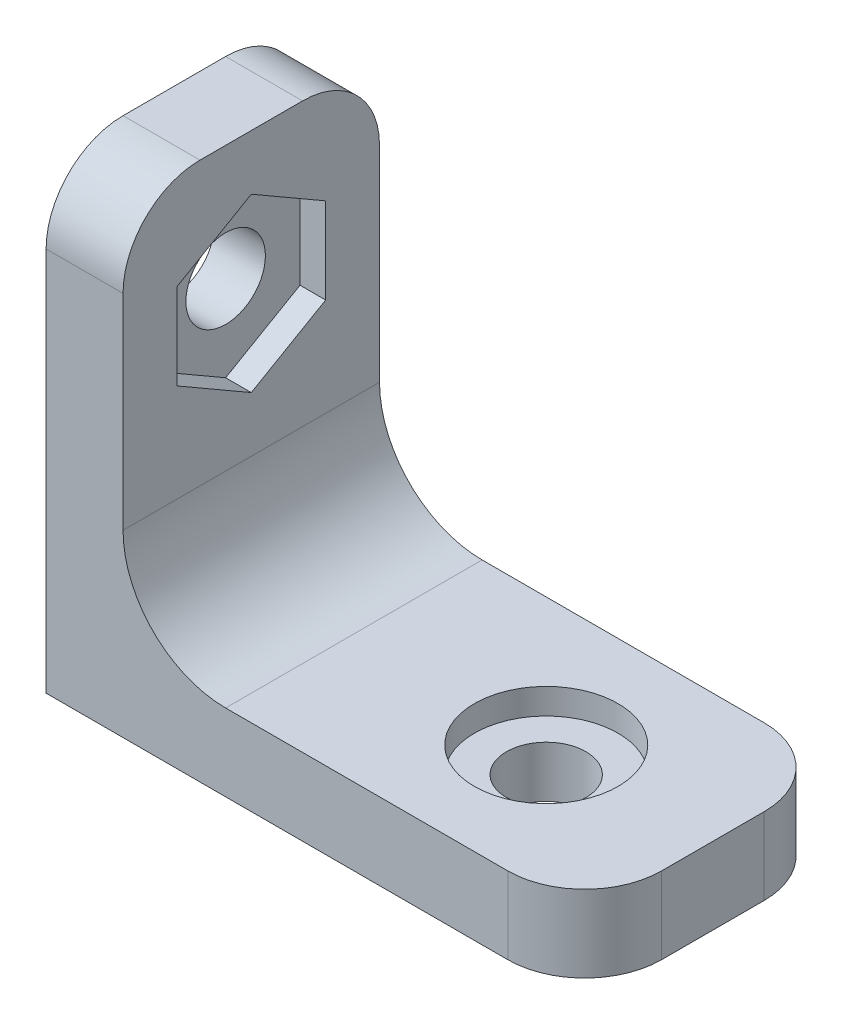
ISO-10303-21;
HEADER;
FILE_DESCRIPTION(('STEP AP214'),'2;1');
FILE_NAME('part.step','',(''),(''),'','','');
FILE_SCHEMA(('AUTOMOTIVE_DESIGN { 1 0 10303 214 1 1 1 1 }'));
ENDSEC;
DATA;
#1=APPLICATION_CONTEXT('core data for automotive mechanical design processes');
#2=APPLICATION_PROTOCOL_DEFINITION('international standard','automotive_design',2000,#1);
#3=PRODUCT_CONTEXT('',#1,'mechanical');
#4=PRODUCT('Part','Part','',(#3));
#5=PRODUCT_RELATED_PRODUCT_CATEGORY('part','',(#4));
#6=PRODUCT_DEFINITION_FORMATION('','',#4);
#7=PRODUCT_DEFINITION_CONTEXT('part definition',#1,'design');
#8=PRODUCT_DEFINITION('design','',#6,#7);
#9=PRODUCT_DEFINITION_SHAPE('','',#8);
#10=(LENGTH_UNIT() NAMED_UNIT(*) SI_UNIT(.MILLI.,.METRE.));
#11=(NAMED_UNIT(*) PLANE_ANGLE_UNIT() SI_UNIT($,.RADIAN.));
#12=(NAMED_UNIT(*) SI_UNIT($,.STERADIAN.) SOLID_ANGLE_UNIT());
#13=UNCERTAINTY_MEASURE_WITH_UNIT(LENGTH_MEASURE(1.E-05),#10,'distance_accuracy_value','');
#14=(GEOMETRIC_REPRESENTATION_CONTEXT(3) GLOBAL_UNCERTAINTY_ASSIGNED_CONTEXT((#13)) GLOBAL_UNIT_ASSIGNED_CONTEXT((#10,
#11,#12)) REPRESENTATION_CONTEXT('',''));
#15=CARTESIAN_POINT('',(0.,0.,0.));
#16=DIRECTION('',(0.,0.,1.));
#17=DIRECTION('',(1.,0.,0.));
#18=AXIS2_PLACEMENT_3D('',#15,#16,#17);
#19=CARTESIAN_POINT('',(7.3840620433566,12.5,-5.));
#20=DIRECTION('',(-1.,0.,0.));
#21=DIRECTION('',(0.,0.,1.));
#22=AXIS2_PLACEMENT_3D('',#19,#20,#21);
#23=CYLINDRICAL_SURFACE('',#22,1.55);
#24=CARTESIAN_POINT('',(0.,12.5,-5.));
#25=DIRECTION('',(-1.,0.,0.));
#26=DIRECTION('',(0.,0.,1.));
#27=AXIS2_PLACEMENT_3D('',#24,#25,#26);
#28=CIRCLE('',#27,1.55);
#29=CARTESIAN_POINT('',(0.,12.5,-3.45));
#30=VERTEX_POINT('',#29);
#31=EDGE_CURVE('E218',#30,#30,#28,.T.);
#32=ORIENTED_EDGE('',*,*,#31,.T.);
#33=EDGE_LOOP('',(#32));
#34=FACE_BOUND('',#33,.T.);
#35=CARTESIAN_POINT('',(2.,12.5,-5.));
#36=DIRECTION('',(1.,0.,0.));
#37=DIRECTION('',(0.,0.,-1.));
#38=AXIS2_PLACEMENT_3D('',#35,#36,#37);
#39=CIRCLE('',#38,1.55);
#40=CARTESIAN_POINT('',(2.,12.5,-6.55));
#41=VERTEX_POINT('',#40);
#42=EDGE_CURVE('E203',#41,#41,#39,.F.);
#43=ORIENTED_EDGE('',*,*,#42,.F.);
#44=EDGE_LOOP('',(#43));
#45=FACE_BOUND('',#44,.T.);
#46=ADVANCED_FACE('F33',(#34,#45),#23,.F.);
#47=CARTESIAN_POINT('',(14.5,3.,-5.));
#48=DIRECTION('',(0.,-1.,0.));
#49=DIRECTION('',(0.,0.,-1.));
#50=AXIS2_PLACEMENT_3D('',#47,#48,#49);
#51=CYLINDRICAL_SURFACE('',#50,1.55);
#52=CARTESIAN_POINT('',(14.5,0.,-5.));
#53=DIRECTION('',(0.,1.,0.));
#54=DIRECTION('',(0.,0.,1.));
#55=AXIS2_PLACEMENT_3D('',#52,#53,#54);
#56=CIRCLE('',#55,1.55);
#57=CARTESIAN_POINT('',(14.5,0.,-3.45));
#58=VERTEX_POINT('',#57);
#59=EDGE_CURVE('E232',#58,#58,#56,.T.);
#60=ORIENTED_EDGE('',*,*,#59,.F.);
#61=EDGE_LOOP('',(#60));
#62=FACE_BOUND('',#61,.T.);
#63=CARTESIAN_POINT('',(14.5,2.,-5.));
#64=DIRECTION('',(0.,1.,0.));
#65=DIRECTION('',(0.,0.,1.));
#66=AXIS2_PLACEMENT_3D('',#63,#64,#65);
#67=CIRCLE('',#66,1.55);
#68=CARTESIAN_POINT('',(14.5,2.,-3.45));
#69=VERTEX_POINT('',#68);
#70=EDGE_CURVE('E214',#69,#69,#67,.T.);
#71=ORIENTED_EDGE('',*,*,#70,.T.);
#72=EDGE_LOOP('',(#71));
#73=FACE_BOUND('',#72,.T.);
#74=ADVANCED_FACE('F336',(#62,#73),#51,.F.);
#75=CARTESIAN_POINT('',(0.,3.,0.));
#76=DIRECTION('',(0.,-1.,0.));
#77=DIRECTION('',(0.,0.,-1.));
#78=AXIS2_PLACEMENT_3D('',#75,#76,#77);
#79=PLANE('',#78);
#80=CARTESIAN_POINT('',(14.5,3.,-5.));
#81=DIRECTION('',(0.,1.,0.));
#82=DIRECTION('',(0.,0.,1.));
#83=AXIS2_PLACEMENT_3D('',#80,#81,#82);
#84=CIRCLE('',#83,2.8);
#85=CARTESIAN_POINT('',(14.5,3.,-2.2));
#86=VERTEX_POINT('',#85);
#87=EDGE_CURVE('E215',#86,#86,#84,.T.);
#88=ORIENTED_EDGE('',*,*,#87,.F.);
#89=EDGE_LOOP('',(#88));
#90=FACE_BOUND('',#89,.T.);
#91=DIRECTION('',(-1.,0.,0.));
#92=VECTOR('',#91,1.);
#93=CARTESIAN_POINT('',(0.,3.,-10.));
#94=LINE('',#93,#92);
#95=CARTESIAN_POINT('',(18.,3.,-10.));
#96=VERTEX_POINT('',#95);
#97=CARTESIAN_POINT('',(7.,3.,-10.));
#98=VERTEX_POINT('',#97);
#99=EDGE_CURVE('E242',#96,#98,#94,.T.);
#100=ORIENTED_EDGE('',*,*,#99,.T.);
#101=DIRECTION('',(0.,0.,-1.));
#102=VECTOR('',#101,1.);
#103=CARTESIAN_POINT('',(7.,3.,0.));
#104=LINE('',#103,#102);
#105=CARTESIAN_POINT('',(7.,3.,0.));
#106=VERTEX_POINT('',#105);
#107=EDGE_CURVE('E54',#98,#106,#104,.F.);
#108=ORIENTED_EDGE('',*,*,#107,.T.);
#109=DIRECTION('',(1.,0.,0.));
#110=VECTOR('',#109,1.);
#111=CARTESIAN_POINT('',(0.,3.,0.));
#112=LINE('',#111,#110);
#113=CARTESIAN_POINT('',(18.,3.,0.));
#114=VERTEX_POINT('',#113);
#115=EDGE_CURVE('E236',#106,#114,#112,.T.);
#116=ORIENTED_EDGE('',*,*,#115,.T.);
#117=CARTESIAN_POINT('',(18.,3.,-3.));
#118=DIRECTION('',(0.,-1.,0.));
#119=DIRECTION('',(0.,0.,-1.));
#120=AXIS2_PLACEMENT_3D('',#117,#118,#119);
#121=CIRCLE('',#120,3.);
#122=CARTESIAN_POINT('',(21.,3.,-3.));
#123=VERTEX_POINT('',#122);
#124=EDGE_CURVE('E297',#114,#123,#121,.F.);
#125=ORIENTED_EDGE('',*,*,#124,.T.);
#126=DIRECTION('',(0.,0.,-1.));
#127=VECTOR('',#126,1.);
#128=CARTESIAN_POINT('',(21.,3.,0.));
#129=LINE('',#128,#127);
#130=CARTESIAN_POINT('',(21.,3.,-7.));
#131=VERTEX_POINT('',#130);
#132=EDGE_CURVE('E238',#123,#131,#129,.T.);
#133=ORIENTED_EDGE('',*,*,#132,.T.);
#134=CARTESIAN_POINT('',(18.,3.,-7.));
#135=DIRECTION('',(0.,-1.,0.));
#136=DIRECTION('',(0.,0.,-1.));
#137=AXIS2_PLACEMENT_3D('',#134,#135,#136);
#138=CIRCLE('',#137,3.);
#139=EDGE_CURVE('E295',#131,#96,#138,.F.);
#140=ORIENTED_EDGE('',*,*,#139,.T.);
#141=EDGE_LOOP('',(#100,#108,#116,#125,#133,#140));
#142=FACE_BOUND('',#141,.T.);
#143=ADVANCED_FACE('F342',(#90,#142),#79,.F.);
#144=CARTESIAN_POINT('',(0.,0.,0.));
#145=DIRECTION('',(0.,-1.,0.));
#146=DIRECTION('',(0.,0.,-1.));
#147=AXIS2_PLACEMENT_3D('',#144,#145,#146);
#148=PLANE('',#147);
#149=DIRECTION('',(0.,0.,-1.));
#150=VECTOR('',#149,1.);
#151=CARTESIAN_POINT('',(21.,0.,0.));
#152=LINE('',#151,#150);
#153=CARTESIAN_POINT('',(21.,0.,-3.));
#154=VERTEX_POINT('',#153);
#155=CARTESIAN_POINT('',(21.,0.,-7.));
#156=VERTEX_POINT('',#155);
#157=EDGE_CURVE('E250',#154,#156,#152,.T.);
#158=ORIENTED_EDGE('',*,*,#157,.F.);
#159=CARTESIAN_POINT('',(18.,0.,-3.));
#160=DIRECTION('',(0.,-1.,0.));
#161=DIRECTION('',(0.,0.,-1.));
#162=AXIS2_PLACEMENT_3D('',#159,#160,#161);
#163=CIRCLE('',#162,3.);
#164=CARTESIAN_POINT('',(18.,0.,0.));
#165=VERTEX_POINT('',#164);
#166=EDGE_CURVE('E293',#154,#165,#163,.T.);
#167=ORIENTED_EDGE('',*,*,#166,.T.);
#168=DIRECTION('',(1.,0.,0.));
#169=VECTOR('',#168,1.);
#170=CARTESIAN_POINT('',(0.,0.,0.));
#171=LINE('',#170,#169);
#172=CARTESIAN_POINT('',(0.,0.,0.));
#173=VERTEX_POINT('',#172);
#174=EDGE_CURVE('E247',#173,#165,#171,.T.);
#175=ORIENTED_EDGE('',*,*,#174,.F.);
#176=DIRECTION('',(0.,0.,1.));
#177=VECTOR('',#176,1.);
#178=CARTESIAN_POINT('',(0.,0.,0.));
#179=LINE('',#178,#177);
#180=CARTESIAN_POINT('',(0.,0.,-10.));
#181=VERTEX_POINT('',#180);
#182=EDGE_CURVE('E235',#181,#173,#179,.T.);
#183=ORIENTED_EDGE('',*,*,#182,.F.);
#184=DIRECTION('',(-1.,0.,0.));
#185=VECTOR('',#184,1.);
#186=CARTESIAN_POINT('',(0.,0.,-10.));
#187=LINE('',#186,#185);
#188=CARTESIAN_POINT('',(18.,0.,-10.));
#189=VERTEX_POINT('',#188);
#190=EDGE_CURVE('E239',#189,#181,#187,.T.);
#191=ORIENTED_EDGE('',*,*,#190,.F.);
#192=CARTESIAN_POINT('',(18.,0.,-7.));
#193=DIRECTION('',(0.,-1.,0.));
#194=DIRECTION('',(0.,0.,-1.));
#195=AXIS2_PLACEMENT_3D('',#192,#193,#194);
#196=CIRCLE('',#195,3.);
#197=EDGE_CURVE('E291',#189,#156,#196,.T.);
#198=ORIENTED_EDGE('',*,*,#197,.T.);
#199=EDGE_LOOP('',(#158,#167,#175,#183,#191,#198));
#200=FACE_BOUND('',#199,.T.);
#201=ORIENTED_EDGE('',*,*,#59,.T.);
#202=EDGE_LOOP('',(#201));
#203=FACE_BOUND('',#202,.T.);
#204=ADVANCED_FACE('F357',(#200,#203),#148,.T.);
#205=CARTESIAN_POINT('',(0.,3.,0.));
#206=DIRECTION('',(1.,0.,0.));
#207=DIRECTION('',(0.,0.,-1.));
#208=AXIS2_PLACEMENT_3D('',#205,#206,#207);
#209=PLANE('',#208);
#210=ORIENTED_EDGE('',*,*,#31,.F.);
#211=EDGE_LOOP('',(#210));
#212=FACE_BOUND('',#211,.T.);
#213=DIRECTION('',(0.,0.,1.));
#214=VECTOR('',#213,1.);
#215=CARTESIAN_POINT('',(0.,18.,-10.));
#216=LINE('',#215,#214);
#217=CARTESIAN_POINT('',(0.,18.,-7.));
#218=VERTEX_POINT('',#217);
#219=CARTESIAN_POINT('',(0.,18.,-3.));
#220=VERTEX_POINT('',#219);
#221=EDGE_CURVE('E221',#218,#220,#216,.T.);
#222=ORIENTED_EDGE('',*,*,#221,.F.);
#223=CARTESIAN_POINT('',(0.,15.,-7.));
#224=DIRECTION('',(1.,0.,0.));
#225=DIRECTION('',(0.,0.,-1.));
#226=AXIS2_PLACEMENT_3D('',#223,#224,#225);
#227=CIRCLE('',#226,3.);
#228=CARTESIAN_POINT('',(0.,15.,-10.));
#229=VERTEX_POINT('',#228);
#230=EDGE_CURVE('E270',#218,#229,#227,.F.);
#231=ORIENTED_EDGE('',*,*,#230,.T.);
#232=DIRECTION('',(0.,-1.,0.));
#233=VECTOR('',#232,1.);
#234=CARTESIAN_POINT('',(0.,3.,-10.));
#235=LINE('',#234,#233);
#236=EDGE_CURVE('E244',#229,#181,#235,.T.);
#237=ORIENTED_EDGE('',*,*,#236,.T.);
#238=ORIENTED_EDGE('',*,*,#182,.T.);
#239=DIRECTION('',(0.,-1.,0.));
#240=VECTOR('',#239,1.);
#241=CARTESIAN_POINT('',(0.,3.,0.));
#242=LINE('',#241,#240);
#243=CARTESIAN_POINT('',(0.,15.,0.));
#244=VERTEX_POINT('',#243);
#245=EDGE_CURVE('E256',#244,#173,#242,.T.);
#246=ORIENTED_EDGE('',*,*,#245,.F.);
#247=CARTESIAN_POINT('',(0.,15.,-3.));
#248=DIRECTION('',(1.,0.,0.));
#249=DIRECTION('',(0.,0.,-1.));
#250=AXIS2_PLACEMENT_3D('',#247,#248,#249);
#251=CIRCLE('',#250,3.);
#252=EDGE_CURVE('E268',#244,#220,#251,.F.);
#253=ORIENTED_EDGE('',*,*,#252,.T.);
#254=EDGE_LOOP('',(#222,#231,#237,#238,#246,#253));
#255=FACE_BOUND('',#254,.T.);
#256=ADVANCED_FACE('F361',(#212,#255),#209,.F.);
#257=CARTESIAN_POINT('',(0.,3.,0.));
#258=DIRECTION('',(0.,0.,-1.));
#259=DIRECTION('',(-1.,0.,0.));
#260=AXIS2_PLACEMENT_3D('',#257,#258,#259);
#261=PLANE('',#260);
#262=DIRECTION('',(0.,-1.,0.));
#263=VECTOR('',#262,1.);
#264=CARTESIAN_POINT('',(3.,18.,0.));
#265=LINE('',#264,#263);
#266=CARTESIAN_POINT('',(3.,15.,0.));
#267=VERTEX_POINT('',#266);
#268=CARTESIAN_POINT('',(3.,7.,0.));
#269=VERTEX_POINT('',#268);
#270=EDGE_CURVE('E229',#267,#269,#265,.T.);
#271=ORIENTED_EDGE('',*,*,#270,.F.);
#272=DIRECTION('',(1.,0.,0.));
#273=VECTOR('',#272,1.);
#274=CARTESIAN_POINT('',(0.,15.,0.));
#275=LINE('',#274,#273);
#276=EDGE_CURVE('E284',#267,#244,#275,.F.);
#277=ORIENTED_EDGE('',*,*,#276,.T.);
#278=ORIENTED_EDGE('',*,*,#245,.T.);
#279=ORIENTED_EDGE('',*,*,#174,.T.);
#280=DIRECTION('',(0.,-1.,0.));
#281=VECTOR('',#280,1.);
#282=CARTESIAN_POINT('',(18.,3.,0.));
#283=LINE('',#282,#281);
#284=EDGE_CURVE('E281',#165,#114,#283,.F.);
#285=ORIENTED_EDGE('',*,*,#284,.T.);
#286=ORIENTED_EDGE('',*,*,#115,.F.);
#287=CARTESIAN_POINT('',(7.,7.,0.));
#288=DIRECTION('',(0.,0.,-1.));
#289=DIRECTION('',(-1.,0.,0.));
#290=AXIS2_PLACEMENT_3D('',#287,#288,#289);
#291=CIRCLE('',#290,4.);
#292=EDGE_CURVE('E11',#106,#269,#291,.T.);
#293=ORIENTED_EDGE('',*,*,#292,.T.);
#294=EDGE_LOOP('',(#271,#277,#278,#279,#285,#286,#293));
#295=FACE_BOUND('',#294,.T.);
#296=ADVANCED_FACE('F326',(#295),#261,.F.);
#297=CARTESIAN_POINT('',(21.,3.,0.));
#298=DIRECTION('',(-1.,0.,0.));
#299=DIRECTION('',(0.,0.,1.));
#300=AXIS2_PLACEMENT_3D('',#297,#298,#299);
#301=PLANE('',#300);
#302=ORIENTED_EDGE('',*,*,#132,.F.);
#303=DIRECTION('',(0.,-1.,0.));
#304=VECTOR('',#303,1.);
#305=CARTESIAN_POINT('',(21.,3.,-3.));
#306=LINE('',#305,#304);
#307=EDGE_CURVE('E288',#123,#154,#306,.T.);
#308=ORIENTED_EDGE('',*,*,#307,.T.);
#309=ORIENTED_EDGE('',*,*,#157,.T.);
#310=DIRECTION('',(0.,-1.,0.));
#311=VECTOR('',#310,1.);
#312=CARTESIAN_POINT('',(21.,3.,-7.));
#313=LINE('',#312,#311);
#314=EDGE_CURVE('E286',#156,#131,#313,.F.);
#315=ORIENTED_EDGE('',*,*,#314,.T.);
#316=EDGE_LOOP('',(#302,#308,#309,#315));
#317=FACE_BOUND('',#316,.T.);
#318=ADVANCED_FACE('F365',(#317),#301,.F.);
#319=CARTESIAN_POINT('',(0.,3.,-10.));
#320=DIRECTION('',(0.,0.,1.));
#321=DIRECTION('',(1.,0.,0.));
#322=AXIS2_PLACEMENT_3D('',#319,#320,#321);
#323=PLANE('',#322);
#324=ORIENTED_EDGE('',*,*,#236,.F.);
#325=DIRECTION('',(-1.,0.,0.));
#326=VECTOR('',#325,1.);
#327=CARTESIAN_POINT('',(3.,15.,-10.));
#328=LINE('',#327,#326);
#329=CARTESIAN_POINT('',(3.,15.,-10.));
#330=VERTEX_POINT('',#329);
#331=EDGE_CURVE('E275',#229,#330,#328,.F.);
#332=ORIENTED_EDGE('',*,*,#331,.T.);
#333=DIRECTION('',(0.,-1.,0.));
#334=VECTOR('',#333,1.);
#335=CARTESIAN_POINT('',(3.,18.,-10.));
#336=LINE('',#335,#334);
#337=CARTESIAN_POINT('',(3.,7.,-10.));
#338=VERTEX_POINT('',#337);
#339=EDGE_CURVE('E227',#330,#338,#336,.T.);
#340=ORIENTED_EDGE('',*,*,#339,.T.);
#341=CARTESIAN_POINT('',(7.,7.,-10.));
#342=DIRECTION('',(0.,0.,1.));
#343=DIRECTION('',(1.,0.,0.));
#344=AXIS2_PLACEMENT_3D('',#341,#342,#343);
#345=CIRCLE('',#344,4.);
#346=EDGE_CURVE('E41',#338,#98,#345,.T.);
#347=ORIENTED_EDGE('',*,*,#346,.T.);
#348=ORIENTED_EDGE('',*,*,#99,.F.);
#349=DIRECTION('',(0.,-1.,0.));
#350=VECTOR('',#349,1.);
#351=CARTESIAN_POINT('',(18.,3.,-10.));
#352=LINE('',#351,#350);
#353=EDGE_CURVE('E272',#96,#189,#352,.T.);
#354=ORIENTED_EDGE('',*,*,#353,.T.);
#355=ORIENTED_EDGE('',*,*,#190,.T.);
#356=EDGE_LOOP('',(#324,#332,#340,#347,#348,#354,#355));
#357=FACE_BOUND('',#356,.T.);
#358=ADVANCED_FACE('F311',(#357),#323,.F.);
#359=CARTESIAN_POINT('',(3.,18.,-10.));
#360=DIRECTION('',(-1.,0.,0.));
#361=DIRECTION('',(0.,0.,1.));
#362=AXIS2_PLACEMENT_3D('',#359,#360,#361);
#363=PLANE('',#362);
#364=DIRECTION('',(0.,0.5,0.866025403784439));
#365=VECTOR('',#364,1.);
#366=CARTESIAN_POINT('',(3.,14.1743157806499,-7.9));
#367=LINE('',#366,#365);
#368=CARTESIAN_POINT('',(3.,14.1743157806499,-7.9));
#369=VERTEX_POINT('',#368);
#370=CARTESIAN_POINT('',(3.,15.8486315612998,-5.));
#371=VERTEX_POINT('',#370);
#372=EDGE_CURVE('E191',#369,#371,#367,.T.);
#373=ORIENTED_EDGE('',*,*,#372,.F.);
#374=DIRECTION('',(0.,1.,0.));
#375=VECTOR('',#374,1.);
#376=CARTESIAN_POINT('',(3.,10.8256842193501,-7.9));
#377=LINE('',#376,#375);
#378=CARTESIAN_POINT('',(3.,10.8256842193501,-7.9));
#379=VERTEX_POINT('',#378);
#380=EDGE_CURVE('E158',#379,#369,#377,.T.);
#381=ORIENTED_EDGE('',*,*,#380,.F.);
#382=DIRECTION('',(0.,0.5,-0.866025403784439));
#383=VECTOR('',#382,1.);
#384=CARTESIAN_POINT('',(3.,9.15136843870017,-5.));
#385=LINE('',#384,#383);
#386=CARTESIAN_POINT('',(3.,9.15136843870017,-5.));
#387=VERTEX_POINT('',#386);
#388=EDGE_CURVE('E177',#387,#379,#385,.T.);
#389=ORIENTED_EDGE('',*,*,#388,.F.);
#390=DIRECTION('',(0.,-0.5,-0.866025403784439));
#391=VECTOR('',#390,1.);
#392=CARTESIAN_POINT('',(3.,10.8256842193501,-2.1));
#393=LINE('',#392,#391);
#394=CARTESIAN_POINT('',(3.,10.8256842193501,-2.1));
#395=VERTEX_POINT('',#394);
#396=EDGE_CURVE('E180',#395,#387,#393,.T.);
#397=ORIENTED_EDGE('',*,*,#396,.F.);
#398=DIRECTION('',(0.,-1.,0.));
#399=VECTOR('',#398,1.);
#400=CARTESIAN_POINT('',(3.,14.1743157806499,-2.1));
#401=LINE('',#400,#399);
#402=CARTESIAN_POINT('',(3.,14.1743157806499,-2.1));
#403=VERTEX_POINT('',#402);
#404=EDGE_CURVE('E196',#403,#395,#401,.T.);
#405=ORIENTED_EDGE('',*,*,#404,.F.);
#406=DIRECTION('',(0.,-0.5,0.866025403784439));
#407=VECTOR('',#406,1.);
#408=CARTESIAN_POINT('',(3.,15.8486315612998,-5.));
#409=LINE('',#408,#407);
#410=EDGE_CURVE('E193',#371,#403,#409,.T.);
#411=ORIENTED_EDGE('',*,*,#410,.F.);
#412=EDGE_LOOP('',(#373,#381,#389,#397,#405,#411));
#413=FACE_BOUND('',#412,.T.);
#414=ORIENTED_EDGE('',*,*,#270,.T.);
#415=DIRECTION('',(0.,0.,-1.));
#416=VECTOR('',#415,1.);
#417=CARTESIAN_POINT('',(3.,7.,-10.));
#418=LINE('',#417,#416);
#419=EDGE_CURVE('E299',#269,#338,#418,.T.);
#420=ORIENTED_EDGE('',*,*,#419,.T.);
#421=ORIENTED_EDGE('',*,*,#339,.F.);
#422=CARTESIAN_POINT('',(3.,15.,-7.));
#423=DIRECTION('',(-1.,0.,0.));
#424=DIRECTION('',(0.,0.,1.));
#425=AXIS2_PLACEMENT_3D('',#422,#423,#424);
#426=CIRCLE('',#425,3.);
#427=CARTESIAN_POINT('',(3.,18.,-7.));
#428=VERTEX_POINT('',#427);
#429=EDGE_CURVE('E279',#330,#428,#426,.F.);
#430=ORIENTED_EDGE('',*,*,#429,.T.);
#431=DIRECTION('',(0.,0.,-1.));
#432=VECTOR('',#431,1.);
#433=CARTESIAN_POINT('',(3.,18.,-10.));
#434=LINE('',#433,#432);
#435=CARTESIAN_POINT('',(3.,18.,-3.));
#436=VERTEX_POINT('',#435);
#437=EDGE_CURVE('E224',#436,#428,#434,.T.);
#438=ORIENTED_EDGE('',*,*,#437,.F.);
#439=CARTESIAN_POINT('',(3.,15.,-3.));
#440=DIRECTION('',(-1.,0.,0.));
#441=DIRECTION('',(0.,0.,1.));
#442=AXIS2_PLACEMENT_3D('',#439,#440,#441);
#443=CIRCLE('',#442,3.);
#444=EDGE_CURVE('E277',#436,#267,#443,.F.);
#445=ORIENTED_EDGE('',*,*,#444,.T.);
#446=EDGE_LOOP('',(#414,#420,#421,#430,#438,#445));
#447=FACE_BOUND('',#446,.T.);
#448=ADVANCED_FACE('F305',(#413,#447),#363,.F.);
#449=CARTESIAN_POINT('',(0.,18.,0.));
#450=DIRECTION('',(0.,1.,0.));
#451=DIRECTION('',(0.,0.,1.));
#452=AXIS2_PLACEMENT_3D('',#449,#450,#451);
#453=PLANE('',#452);
#454=ORIENTED_EDGE('',*,*,#437,.T.);
#455=DIRECTION('',(-1.,0.,0.));
#456=VECTOR('',#455,1.);
#457=CARTESIAN_POINT('',(0.,18.,-7.));
#458=LINE('',#457,#456);
#459=EDGE_CURVE('E265',#428,#218,#458,.T.);
#460=ORIENTED_EDGE('',*,*,#459,.T.);
#461=ORIENTED_EDGE('',*,*,#221,.T.);
#462=DIRECTION('',(1.,0.,0.));
#463=VECTOR('',#462,1.);
#464=CARTESIAN_POINT('',(3.,18.,-3.));
#465=LINE('',#464,#463);
#466=EDGE_CURVE('E258',#220,#436,#465,.T.);
#467=ORIENTED_EDGE('',*,*,#466,.T.);
#468=EDGE_LOOP('',(#454,#460,#461,#467));
#469=FACE_BOUND('',#468,.T.);
#470=ADVANCED_FACE('F318',(#469),#453,.T.);
#471=CARTESIAN_POINT('',(14.5,2.,-5.));
#472=DIRECTION('',(0.,1.,0.));
#473=DIRECTION('',(0.,0.,1.));
#474=AXIS2_PLACEMENT_3D('',#471,#472,#473);
#475=CYLINDRICAL_SURFACE('',#474,2.8);
#476=CARTESIAN_POINT('',(14.5,2.,-5.));
#477=DIRECTION('',(0.,1.,0.));
#478=DIRECTION('',(0.,0.,1.));
#479=AXIS2_PLACEMENT_3D('',#476,#477,#478);
#480=CIRCLE('',#479,2.8);
#481=CARTESIAN_POINT('',(14.5,2.,-2.2));
#482=VERTEX_POINT('',#481);
#483=EDGE_CURVE('E211',#482,#482,#480,.T.);
#484=ORIENTED_EDGE('',*,*,#483,.F.);
#485=EDGE_LOOP('',(#484));
#486=FACE_BOUND('',#485,.T.);
#487=ORIENTED_EDGE('',*,*,#87,.T.);
#488=EDGE_LOOP('',(#487));
#489=FACE_BOUND('',#488,.T.);
#490=ADVANCED_FACE('F348',(#486,#489),#475,.F.);
#491=CARTESIAN_POINT('',(14.5,2.,-5.));
#492=DIRECTION('',(0.,1.,0.));
#493=DIRECTION('',(0.,0.,1.));
#494=AXIS2_PLACEMENT_3D('',#491,#492,#493);
#495=PLANE('',#494);
#496=ORIENTED_EDGE('',*,*,#70,.F.);
#497=EDGE_LOOP('',(#496));
#498=FACE_BOUND('',#497,.T.);
#499=ORIENTED_EDGE('',*,*,#483,.T.);
#500=EDGE_LOOP('',(#499));
#501=FACE_BOUND('',#500,.T.);
#502=ADVANCED_FACE('F399',(#498,#501),#495,.T.);
#503=CARTESIAN_POINT('',(2.,0.,0.));
#504=DIRECTION('',(1.,0.,0.));
#505=DIRECTION('',(0.,0.,-1.));
#506=AXIS2_PLACEMENT_3D('',#503,#504,#505);
#507=PLANE('',#506);
#508=DIRECTION('',(0.,1.,0.));
#509=VECTOR('',#508,1.);
#510=CARTESIAN_POINT('',(2.,10.8256842193501,-7.9));
#511=LINE('',#510,#509);
#512=CARTESIAN_POINT('',(2.,10.8256842193501,-7.9));
#513=VERTEX_POINT('',#512);
#514=CARTESIAN_POINT('',(2.,14.1743157806499,-7.9));
#515=VERTEX_POINT('',#514);
#516=EDGE_CURVE('E155',#513,#515,#511,.T.);
#517=ORIENTED_EDGE('',*,*,#516,.T.);
#518=DIRECTION('',(0.,0.5,0.866025403784439));
#519=VECTOR('',#518,1.);
#520=CARTESIAN_POINT('',(2.,14.1743157806499,-7.9));
#521=LINE('',#520,#519);
#522=CARTESIAN_POINT('',(2.,15.8486315612998,-5.));
#523=VERTEX_POINT('',#522);
#524=EDGE_CURVE('E166',#515,#523,#521,.T.);
#525=ORIENTED_EDGE('',*,*,#524,.T.);
#526=DIRECTION('',(0.,-0.5,0.866025403784439));
#527=VECTOR('',#526,1.);
#528=CARTESIAN_POINT('',(2.,15.8486315612998,-5.));
#529=LINE('',#528,#527);
#530=CARTESIAN_POINT('',(2.,14.1743157806499,-2.1));
#531=VERTEX_POINT('',#530);
#532=EDGE_CURVE('E171',#523,#531,#529,.T.);
#533=ORIENTED_EDGE('',*,*,#532,.T.);
#534=DIRECTION('',(0.,-1.,0.));
#535=VECTOR('',#534,1.);
#536=CARTESIAN_POINT('',(2.,14.1743157806499,-2.1));
#537=LINE('',#536,#535);
#538=CARTESIAN_POINT('',(2.,10.8256842193501,-2.1));
#539=VERTEX_POINT('',#538);
#540=EDGE_CURVE('E184',#531,#539,#537,.T.);
#541=ORIENTED_EDGE('',*,*,#540,.T.);
#542=DIRECTION('',(0.,-0.5,-0.866025403784439));
#543=VECTOR('',#542,1.);
#544=CARTESIAN_POINT('',(2.,10.8256842193501,-2.1));
#545=LINE('',#544,#543);
#546=CARTESIAN_POINT('',(2.,9.15136843870017,-5.));
#547=VERTEX_POINT('',#546);
#548=EDGE_CURVE('E187',#539,#547,#545,.T.);
#549=ORIENTED_EDGE('',*,*,#548,.T.);
#550=DIRECTION('',(0.,0.5,-0.866025403784439));
#551=VECTOR('',#550,1.);
#552=CARTESIAN_POINT('',(2.,9.15136843870017,-5.));
#553=LINE('',#552,#551);
#554=EDGE_CURVE('E163',#547,#513,#553,.T.);
#555=ORIENTED_EDGE('',*,*,#554,.T.);
#556=EDGE_LOOP('',(#517,#525,#533,#541,#549,#555));
#557=FACE_BOUND('',#556,.T.);
#558=ORIENTED_EDGE('',*,*,#42,.T.);
#559=EDGE_LOOP('',(#558));
#560=FACE_BOUND('',#559,.T.);
#561=ADVANCED_FACE('F173',(#557,#560),#507,.T.);
#562=CARTESIAN_POINT('',(2.,10.8256842193501,-7.9));
#563=DIRECTION('',(0.,0.,-1.));
#564=DIRECTION('',(-1.,0.,0.));
#565=AXIS2_PLACEMENT_3D('',#562,#563,#564);
#566=PLANE('',#565);
#567=ORIENTED_EDGE('',*,*,#380,.T.);
#568=DIRECTION('',(1.,0.,0.));
#569=VECTOR('',#568,1.);
#570=CARTESIAN_POINT('',(2.,14.1743157806499,-7.9));
#571=LINE('',#570,#569);
#572=EDGE_CURVE('E151',#515,#369,#571,.T.);
#573=ORIENTED_EDGE('',*,*,#572,.F.);
#574=ORIENTED_EDGE('',*,*,#516,.F.);
#575=DIRECTION('',(1.,0.,0.));
#576=VECTOR('',#575,1.);
#577=CARTESIAN_POINT('',(2.,10.8256842193501,-7.9));
#578=LINE('',#577,#576);
#579=EDGE_CURVE('E201',#513,#379,#578,.T.);
#580=ORIENTED_EDGE('',*,*,#579,.T.);
#581=EDGE_LOOP('',(#567,#573,#574,#580));
#582=FACE_BOUND('',#581,.T.);
#583=ADVANCED_FACE('F153',(#582),#566,.F.);
#584=CARTESIAN_POINT('',(2.,9.15136843870017,-5.));
#585=DIRECTION('',(0.,-0.866025403784439,-0.5));
#586=DIRECTION('',(0.,0.5,-0.866025403784439));
#587=AXIS2_PLACEMENT_3D('',#584,#585,#586);
#588=PLANE('',#587);
#589=ORIENTED_EDGE('',*,*,#388,.T.);
#590=ORIENTED_EDGE('',*,*,#579,.F.);
#591=ORIENTED_EDGE('',*,*,#554,.F.);
#592=DIRECTION('',(1.,0.,0.));
#593=VECTOR('',#592,1.);
#594=CARTESIAN_POINT('',(2.,9.15136843870017,-5.));
#595=LINE('',#594,#593);
#596=EDGE_CURVE('E204',#547,#387,#595,.T.);
#597=ORIENTED_EDGE('',*,*,#596,.T.);
#598=EDGE_LOOP('',(#589,#590,#591,#597));
#599=FACE_BOUND('',#598,.T.);
#600=ADVANCED_FACE('F428',(#599),#588,.F.);
#601=CARTESIAN_POINT('',(2.,10.8256842193501,-2.1));
#602=DIRECTION('',(0.,-0.866025403784439,0.5));
#603=DIRECTION('',(0.,-0.5,-0.866025403784439));
#604=AXIS2_PLACEMENT_3D('',#601,#602,#603);
#605=PLANE('',#604);
#606=ORIENTED_EDGE('',*,*,#396,.T.);
#607=ORIENTED_EDGE('',*,*,#596,.F.);
#608=ORIENTED_EDGE('',*,*,#548,.F.);
#609=DIRECTION('',(1.,0.,0.));
#610=VECTOR('',#609,1.);
#611=CARTESIAN_POINT('',(2.,10.8256842193501,-2.1));
#612=LINE('',#611,#610);
#613=EDGE_CURVE('E206',#539,#395,#612,.T.);
#614=ORIENTED_EDGE('',*,*,#613,.T.);
#615=EDGE_LOOP('',(#606,#607,#608,#614));
#616=FACE_BOUND('',#615,.T.);
#617=ADVANCED_FACE('F435',(#616),#605,.F.);
#618=CARTESIAN_POINT('',(2.,14.1743157806499,-2.1));
#619=DIRECTION('',(0.,0.,1.));
#620=DIRECTION('',(1.,0.,0.));
#621=AXIS2_PLACEMENT_3D('',#618,#619,#620);
#622=PLANE('',#621);
#623=ORIENTED_EDGE('',*,*,#404,.T.);
#624=ORIENTED_EDGE('',*,*,#613,.F.);
#625=ORIENTED_EDGE('',*,*,#540,.F.);
#626=DIRECTION('',(1.,0.,0.));
#627=VECTOR('',#626,1.);
#628=CARTESIAN_POINT('',(2.,14.1743157806499,-2.1));
#629=LINE('',#628,#627);
#630=EDGE_CURVE('E208',#531,#403,#629,.T.);
#631=ORIENTED_EDGE('',*,*,#630,.T.);
#632=EDGE_LOOP('',(#623,#624,#625,#631));
#633=FACE_BOUND('',#632,.T.);
#634=ADVANCED_FACE('F443',(#633),#622,.F.);
#635=CARTESIAN_POINT('',(2.,15.8486315612998,-5.));
#636=DIRECTION('',(0.,0.866025403784439,0.5));
#637=DIRECTION('',(0.,-0.5,0.866025403784439));
#638=AXIS2_PLACEMENT_3D('',#635,#636,#637);
#639=PLANE('',#638);
#640=ORIENTED_EDGE('',*,*,#410,.T.);
#641=ORIENTED_EDGE('',*,*,#630,.F.);
#642=ORIENTED_EDGE('',*,*,#532,.F.);
#643=DIRECTION('',(1.,0.,0.));
#644=VECTOR('',#643,1.);
#645=CARTESIAN_POINT('',(2.,15.8486315612998,-5.));
#646=LINE('',#645,#644);
#647=EDGE_CURVE('E162',#523,#371,#646,.T.);
#648=ORIENTED_EDGE('',*,*,#647,.T.);
#649=EDGE_LOOP('',(#640,#641,#642,#648));
#650=FACE_BOUND('',#649,.T.);
#651=ADVANCED_FACE('F451',(#650),#639,.F.);
#652=CARTESIAN_POINT('',(2.,14.1743157806499,-7.9));
#653=DIRECTION('',(0.,0.866025403784439,-0.5));
#654=DIRECTION('',(0.,0.5,0.866025403784439));
#655=AXIS2_PLACEMENT_3D('',#652,#653,#654);
#656=PLANE('',#655);
#657=ORIENTED_EDGE('',*,*,#372,.T.);
#658=ORIENTED_EDGE('',*,*,#647,.F.);
#659=ORIENTED_EDGE('',*,*,#524,.F.);
#660=ORIENTED_EDGE('',*,*,#572,.T.);
#661=EDGE_LOOP('',(#657,#658,#659,#660));
#662=FACE_BOUND('',#661,.T.);
#663=ADVANCED_FACE('F167',(#662),#656,.F.);
#664=CARTESIAN_POINT('',(0.,15.,-7.));
#665=DIRECTION('',(1.,0.,0.));
#666=DIRECTION('',(0.,0.,-1.));
#667=AXIS2_PLACEMENT_3D('',#664,#665,#666);
#668=CYLINDRICAL_SURFACE('',#667,3.);
#669=ORIENTED_EDGE('',*,*,#429,.F.);
#670=ORIENTED_EDGE('',*,*,#331,.F.);
#671=ORIENTED_EDGE('',*,*,#230,.F.);
#672=ORIENTED_EDGE('',*,*,#459,.F.);
#673=EDGE_LOOP('',(#669,#670,#671,#672));
#674=FACE_BOUND('',#673,.T.);
#675=ADVANCED_FACE('F314',(#674),#668,.T.);
#676=CARTESIAN_POINT('',(0.,15.,-3.));
#677=DIRECTION('',(-1.,0.,0.));
#678=DIRECTION('',(0.,0.,1.));
#679=AXIS2_PLACEMENT_3D('',#676,#677,#678);
#680=CYLINDRICAL_SURFACE('',#679,3.);
#681=ORIENTED_EDGE('',*,*,#252,.F.);
#682=ORIENTED_EDGE('',*,*,#276,.F.);
#683=ORIENTED_EDGE('',*,*,#444,.F.);
#684=ORIENTED_EDGE('',*,*,#466,.F.);
#685=EDGE_LOOP('',(#681,#682,#683,#684));
#686=FACE_BOUND('',#685,.T.);
#687=ADVANCED_FACE('F323',(#686),#680,.T.);
#688=CARTESIAN_POINT('',(18.,3.,-3.));
#689=DIRECTION('',(0.,-1.,0.));
#690=DIRECTION('',(0.,0.,-1.));
#691=AXIS2_PLACEMENT_3D('',#688,#689,#690);
#692=CYLINDRICAL_SURFACE('',#691,3.);
#693=ORIENTED_EDGE('',*,*,#124,.F.);
#694=ORIENTED_EDGE('',*,*,#284,.F.);
#695=ORIENTED_EDGE('',*,*,#166,.F.);
#696=ORIENTED_EDGE('',*,*,#307,.F.);
#697=EDGE_LOOP('',(#693,#694,#695,#696));
#698=FACE_BOUND('',#697,.T.);
#699=ADVANCED_FACE('F333',(#698),#692,.T.);
#700=CARTESIAN_POINT('',(18.,3.,-7.));
#701=DIRECTION('',(0.,-1.,0.));
#702=DIRECTION('',(0.,0.,-1.));
#703=AXIS2_PLACEMENT_3D('',#700,#701,#702);
#704=CYLINDRICAL_SURFACE('',#703,3.);
#705=ORIENTED_EDGE('',*,*,#139,.F.);
#706=ORIENTED_EDGE('',*,*,#314,.F.);
#707=ORIENTED_EDGE('',*,*,#197,.F.);
#708=ORIENTED_EDGE('',*,*,#353,.F.);
#709=EDGE_LOOP('',(#705,#706,#707,#708));
#710=FACE_BOUND('',#709,.T.);
#711=ADVANCED_FACE('F329',(#710),#704,.T.);
#712=CARTESIAN_POINT('',(7.,7.,-10.));
#713=DIRECTION('',(0.,0.,1.));
#714=DIRECTION('',(1.,0.,0.));
#715=AXIS2_PLACEMENT_3D('',#712,#713,#714);
#716=CYLINDRICAL_SURFACE('',#715,4.);
#717=ORIENTED_EDGE('',*,*,#292,.F.);
#718=ORIENTED_EDGE('',*,*,#107,.F.);
#719=ORIENTED_EDGE('',*,*,#346,.F.);
#720=ORIENTED_EDGE('',*,*,#419,.F.);
#721=EDGE_LOOP('',(#717,#718,#719,#720));
#722=FACE_BOUND('',#721,.T.);
#723=ADVANCED_FACE('F35',(#722),#716,.F.);
#724=CLOSED_SHELL('',(#46,#74,#143,#204,#256,#296,#318,#358,#448,#470,#490,#502,#561,#583,#600,
#617,#634,#651,#663,#675,#687,#699,#711,#723));
#725=MANIFOLD_SOLID_BREP('B2',#724);
#726=ADVANCED_BREP_SHAPE_REPRESENTATION('',(#18,#725),#14);
#727=SHAPE_DEFINITION_REPRESENTATION(#9,#726);
ENDSEC;
END-ISO-10303-21;
